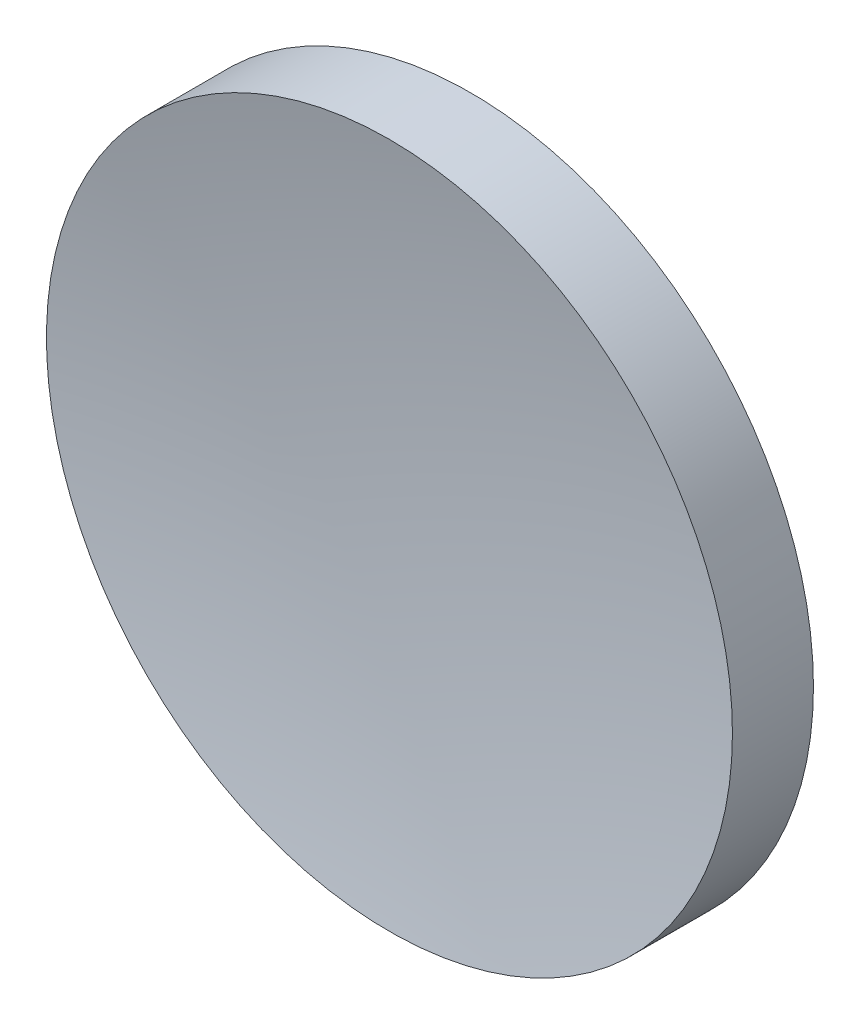
ISO-10303-21;
HEADER;
FILE_DESCRIPTION(('STEP AP214'),'2;1');
FILE_NAME('part.step','',(''),(''),'','','');
FILE_SCHEMA(('AUTOMOTIVE_DESIGN { 1 0 10303 214 1 1 1 1 }'));
ENDSEC;
DATA;
#1=APPLICATION_CONTEXT('core data for automotive mechanical design processes');
#2=APPLICATION_PROTOCOL_DEFINITION('international standard','automotive_design',2000,#1);
#3=PRODUCT_CONTEXT('',#1,'mechanical');
#4=PRODUCT('Part','Part','',(#3));
#5=PRODUCT_RELATED_PRODUCT_CATEGORY('part','',(#4));
#6=PRODUCT_DEFINITION_FORMATION('','',#4);
#7=PRODUCT_DEFINITION_CONTEXT('part definition',#1,'design');
#8=PRODUCT_DEFINITION('design','',#6,#7);
#9=PRODUCT_DEFINITION_SHAPE('','',#8);
#10=(LENGTH_UNIT() NAMED_UNIT(*) SI_UNIT(.MILLI.,.METRE.));
#11=(NAMED_UNIT(*) PLANE_ANGLE_UNIT() SI_UNIT($,.RADIAN.));
#12=(NAMED_UNIT(*) SI_UNIT($,.STERADIAN.) SOLID_ANGLE_UNIT());
#13=UNCERTAINTY_MEASURE_WITH_UNIT(LENGTH_MEASURE(1.E-05),#10,'distance_accuracy_value','');
#14=(GEOMETRIC_REPRESENTATION_CONTEXT(3) GLOBAL_UNCERTAINTY_ASSIGNED_CONTEXT((#13)) GLOBAL_UNIT_ASSIGNED_CONTEXT((#10,
#11,#12)) REPRESENTATION_CONTEXT('',''));
#15=CARTESIAN_POINT('',(0.,0.,0.));
#16=DIRECTION('',(0.,0.,1.));
#17=DIRECTION('',(1.,0.,0.));
#18=AXIS2_PLACEMENT_3D('',#15,#16,#17);
#19=CARTESIAN_POINT('',(0.,0.,3.));
#20=DIRECTION('',(0.,0.,-1.));
#21=DIRECTION('',(-1.,0.,0.));
#22=AXIS2_PLACEMENT_3D('',#19,#20,#21);
#23=CYLINDRICAL_SURFACE('',#22,12.7);
#24=CARTESIAN_POINT('',(0.,0.,3.));
#25=DIRECTION('',(0.,0.,1.));
#26=DIRECTION('',(1.,0.,0.));
#27=AXIS2_PLACEMENT_3D('',#24,#25,#26);
#28=CIRCLE('',#27,12.7);
#29=CARTESIAN_POINT('',(12.7,0.,3.));
#30=VERTEX_POINT('',#29);
#31=EDGE_CURVE('E41',#30,#30,#28,.F.);
#32=ORIENTED_EDGE('',*,*,#31,.T.);
#33=EDGE_LOOP('',(#32));
#34=FACE_BOUND('',#33,.T.);
#35=CARTESIAN_POINT('',(0.,0.,0.));
#36=DIRECTION('',(0.,0.,1.));
#37=DIRECTION('',(1.,0.,0.));
#38=AXIS2_PLACEMENT_3D('',#35,#36,#37);
#39=CIRCLE('',#38,12.7);
#40=CARTESIAN_POINT('',(12.7,0.,0.));
#41=VERTEX_POINT('',#40);
#42=EDGE_CURVE('E10',#41,#41,#39,.T.);
#43=ORIENTED_EDGE('',*,*,#42,.T.);
#44=EDGE_LOOP('',(#43));
#45=FACE_BOUND('',#44,.T.);
#46=ADVANCED_FACE('F35',(#34,#45),#23,.T.);
#47=CARTESIAN_POINT('',(0.,0.,0.));
#48=DIRECTION('',(0.,0.,1.));
#49=DIRECTION('',(1.,0.,0.));
#50=AXIS2_PLACEMENT_3D('',#47,#48,#49);
#51=PLANE('',#50);
#52=ORIENTED_EDGE('',*,*,#42,.F.);
#53=EDGE_LOOP('',(#52));
#54=FACE_BOUND('',#53,.T.);
#55=ADVANCED_FACE('F50',(#54),#51,.F.);
#56=CARTESIAN_POINT('',(0.,0.,69.9615585073846));
#57=DIRECTION('',(0.,0.,1.));
#58=DIRECTION('',(0.,1.,0.));
#59=AXIS2_PLACEMENT_3D('',#56,#57,#58);
#60=SPHERICAL_SURFACE('',#59,68.15526625095);
#61=ORIENTED_EDGE('',*,*,#31,.F.);
#62=EDGE_LOOP('',(#61));
#63=FACE_BOUND('',#62,.T.);
#64=ADVANCED_FACE('F48',(#63),#60,.F.);
#65=CLOSED_SHELL('',(#46,#55,#64));
#66=MANIFOLD_SOLID_BREP('B2',#65);
#67=ADVANCED_BREP_SHAPE_REPRESENTATION('',(#18,#66),#14);
#68=SHAPE_DEFINITION_REPRESENTATION(#9,#67);
ENDSEC;
END-ISO-10303-21;
